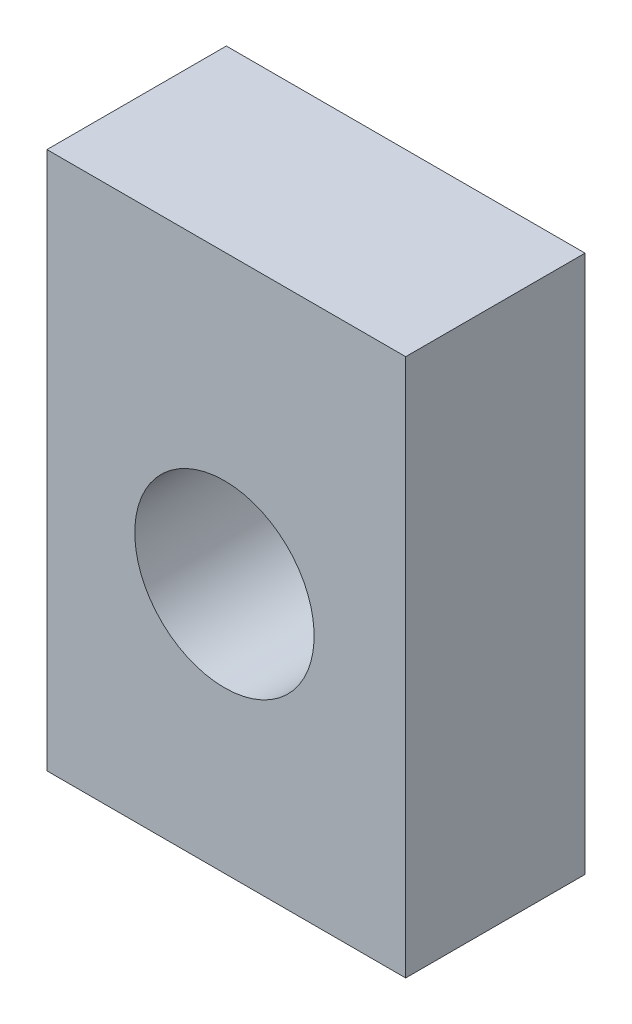
ISO-10303-21;
HEADER;
FILE_DESCRIPTION(('STEP AP214'),'2;1');
FILE_NAME('part.step','',(''),(''),'','','');
FILE_SCHEMA(('AUTOMOTIVE_DESIGN { 1 0 10303 214 1 1 1 1 }'));
ENDSEC;
DATA;
#1=APPLICATION_CONTEXT('core data for automotive mechanical design processes');
#2=APPLICATION_PROTOCOL_DEFINITION('international standard','automotive_design',2000,#1);
#3=PRODUCT_CONTEXT('',#1,'mechanical');
#4=PRODUCT('Part','Part','',(#3));
#5=PRODUCT_RELATED_PRODUCT_CATEGORY('part','',(#4));
#6=PRODUCT_DEFINITION_FORMATION('','',#4);
#7=PRODUCT_DEFINITION_CONTEXT('part definition',#1,'design');
#8=PRODUCT_DEFINITION('design','',#6,#7);
#9=PRODUCT_DEFINITION_SHAPE('','',#8);
#10=(LENGTH_UNIT() NAMED_UNIT(*) SI_UNIT(.MILLI.,.METRE.));
#11=(NAMED_UNIT(*) PLANE_ANGLE_UNIT() SI_UNIT($,.RADIAN.));
#12=(NAMED_UNIT(*) SI_UNIT($,.STERADIAN.) SOLID_ANGLE_UNIT());
#13=UNCERTAINTY_MEASURE_WITH_UNIT(LENGTH_MEASURE(1.E-05),#10,'distance_accuracy_value','');
#14=(GEOMETRIC_REPRESENTATION_CONTEXT(3) GLOBAL_UNCERTAINTY_ASSIGNED_CONTEXT((#13)) GLOBAL_UNIT_ASSIGNED_CONTEXT((#10,
#11,#12)) REPRESENTATION_CONTEXT('',''));
#15=CARTESIAN_POINT('',(0.,0.,0.));
#16=DIRECTION('',(0.,0.,1.));
#17=DIRECTION('',(1.,0.,0.));
#18=AXIS2_PLACEMENT_3D('',#15,#16,#17);
#19=CARTESIAN_POINT('',(12.7,9.525,-3.175));
#20=DIRECTION('',(0.,0.,1.));
#21=DIRECTION('',(0.,-1.,0.));
#22=AXIS2_PLACEMENT_3D('',#19,#20,#21);
#23=PLANE('',#22);
#24=CARTESIAN_POINT('',(6.28405567622139,-0.659443237786025,-3.175));
#25=DIRECTION('',(0.,0.,-1.));
#26=DIRECTION('',(0.,1.,0.));
#27=AXIS2_PLACEMENT_3D('',#24,#25,#26);
#28=CIRCLE('',#27,3.175);
#29=CARTESIAN_POINT('',(6.28405567622139,2.51555676221398,-3.175));
#30=VERTEX_POINT('',#29);
#31=EDGE_CURVE('E134',#30,#30,#28,.T.);
#32=ORIENTED_EDGE('',*,*,#31,.F.);
#33=EDGE_LOOP('',(#32));
#34=FACE_BOUND('',#33,.T.);
#35=DIRECTION('',(0.,1.,0.));
#36=VECTOR('',#35,1.);
#37=CARTESIAN_POINT('',(0.,9.525,-3.175));
#38=LINE('',#37,#36);
#39=CARTESIAN_POINT('',(0.,-9.525,-3.175));
#40=VERTEX_POINT('',#39);
#41=CARTESIAN_POINT('',(0.,9.525,-3.175));
#42=VERTEX_POINT('',#41);
#43=EDGE_CURVE('E113',#40,#42,#38,.T.);
#44=ORIENTED_EDGE('',*,*,#43,.T.);
#45=DIRECTION('',(-1.,0.,0.));
#46=VECTOR('',#45,1.);
#47=CARTESIAN_POINT('',(12.7,9.525,-3.175));
#48=LINE('',#47,#46);
#49=CARTESIAN_POINT('',(12.7,9.525,-3.175));
#50=VERTEX_POINT('',#49);
#51=EDGE_CURVE('E11',#50,#42,#48,.T.);
#52=ORIENTED_EDGE('',*,*,#51,.F.);
#53=DIRECTION('',(0.,1.,0.));
#54=VECTOR('',#53,1.);
#55=CARTESIAN_POINT('',(12.7,9.525,-3.175));
#56=LINE('',#55,#54);
#57=CARTESIAN_POINT('',(12.7,-9.525,-3.175));
#58=VERTEX_POINT('',#57);
#59=EDGE_CURVE('E97',#58,#50,#56,.T.);
#60=ORIENTED_EDGE('',*,*,#59,.F.);
#61=DIRECTION('',(-1.,0.,0.));
#62=VECTOR('',#61,1.);
#63=CARTESIAN_POINT('',(12.7,-9.525,-3.175));
#64=LINE('',#63,#62);
#65=EDGE_CURVE('E112',#58,#40,#64,.T.);
#66=ORIENTED_EDGE('',*,*,#65,.T.);
#67=EDGE_LOOP('',(#44,#52,#60,#66));
#68=FACE_BOUND('',#67,.T.);
#69=ADVANCED_FACE('F44',(#34,#68),#23,.F.);
#70=CARTESIAN_POINT('',(12.7,9.525,3.175));
#71=DIRECTION('',(0.,-1.,0.));
#72=DIRECTION('',(0.,0.,-1.));
#73=AXIS2_PLACEMENT_3D('',#70,#71,#72);
#74=PLANE('',#73);
#75=DIRECTION('',(0.,0.,1.));
#76=VECTOR('',#75,1.);
#77=CARTESIAN_POINT('',(0.,9.525,3.175));
#78=LINE('',#77,#76);
#79=CARTESIAN_POINT('',(0.,9.525,3.175));
#80=VERTEX_POINT('',#79);
#81=EDGE_CURVE('E104',#42,#80,#78,.T.);
#82=ORIENTED_EDGE('',*,*,#81,.T.);
#83=DIRECTION('',(-1.,0.,0.));
#84=VECTOR('',#83,1.);
#85=CARTESIAN_POINT('',(12.7,9.525,3.175));
#86=LINE('',#85,#84);
#87=CARTESIAN_POINT('',(12.7,9.525,3.175));
#88=VERTEX_POINT('',#87);
#89=EDGE_CURVE('E54',#88,#80,#86,.T.);
#90=ORIENTED_EDGE('',*,*,#89,.F.);
#91=DIRECTION('',(0.,0.,1.));
#92=VECTOR('',#91,1.);
#93=CARTESIAN_POINT('',(12.7,9.525,3.175));
#94=LINE('',#93,#92);
#95=EDGE_CURVE('E93',#50,#88,#94,.T.);
#96=ORIENTED_EDGE('',*,*,#95,.F.);
#97=ORIENTED_EDGE('',*,*,#51,.T.);
#98=EDGE_LOOP('',(#82,#90,#96,#97));
#99=FACE_BOUND('',#98,.T.);
#100=ADVANCED_FACE('F105',(#99),#74,.F.);
#101=CARTESIAN_POINT('',(12.7,9.525,3.175));
#102=DIRECTION('',(0.,0.,-1.));
#103=DIRECTION('',(0.,1.,0.));
#104=AXIS2_PLACEMENT_3D('',#101,#102,#103);
#105=PLANE('',#104);
#106=CARTESIAN_POINT('',(6.28405567622139,-0.659443237786025,3.175));
#107=DIRECTION('',(0.,0.,-1.));
#108=DIRECTION('',(0.,1.,0.));
#109=AXIS2_PLACEMENT_3D('',#106,#107,#108);
#110=CIRCLE('',#109,3.175);
#111=CARTESIAN_POINT('',(6.28405567622139,2.51555676221397,3.175));
#112=VERTEX_POINT('',#111);
#113=EDGE_CURVE('E48',#112,#112,#110,.T.);
#114=ORIENTED_EDGE('',*,*,#113,.T.);
#115=EDGE_LOOP('',(#114));
#116=FACE_BOUND('',#115,.T.);
#117=DIRECTION('',(0.,-1.,0.));
#118=VECTOR('',#117,1.);
#119=CARTESIAN_POINT('',(0.,9.525,3.175));
#120=LINE('',#119,#118);
#121=CARTESIAN_POINT('',(0.,-9.525,3.175));
#122=VERTEX_POINT('',#121);
#123=EDGE_CURVE('E79',#80,#122,#120,.T.);
#124=ORIENTED_EDGE('',*,*,#123,.T.);
#125=DIRECTION('',(-1.,0.,0.));
#126=VECTOR('',#125,1.);
#127=CARTESIAN_POINT('',(12.7,-9.525,3.175));
#128=LINE('',#127,#126);
#129=CARTESIAN_POINT('',(12.7,-9.525,3.175));
#130=VERTEX_POINT('',#129);
#131=EDGE_CURVE('E103',#130,#122,#128,.T.);
#132=ORIENTED_EDGE('',*,*,#131,.F.);
#133=DIRECTION('',(0.,-1.,0.));
#134=VECTOR('',#133,1.);
#135=CARTESIAN_POINT('',(12.7,9.525,3.175));
#136=LINE('',#135,#134);
#137=EDGE_CURVE('E96',#88,#130,#136,.T.);
#138=ORIENTED_EDGE('',*,*,#137,.F.);
#139=ORIENTED_EDGE('',*,*,#89,.T.);
#140=EDGE_LOOP('',(#124,#132,#138,#139));
#141=FACE_BOUND('',#140,.T.);
#142=ADVANCED_FACE('F110',(#116,#141),#105,.F.);
#143=CARTESIAN_POINT('',(12.7,-9.525,3.175));
#144=DIRECTION('',(0.,1.,0.));
#145=DIRECTION('',(0.,0.,1.));
#146=AXIS2_PLACEMENT_3D('',#143,#144,#145);
#147=PLANE('',#146);
#148=DIRECTION('',(0.,0.,-1.));
#149=VECTOR('',#148,1.);
#150=CARTESIAN_POINT('',(0.,-9.525,3.175));
#151=LINE('',#150,#149);
#152=EDGE_CURVE('E86',#122,#40,#151,.T.);
#153=ORIENTED_EDGE('',*,*,#152,.T.);
#154=ORIENTED_EDGE('',*,*,#65,.F.);
#155=DIRECTION('',(0.,0.,-1.));
#156=VECTOR('',#155,1.);
#157=CARTESIAN_POINT('',(12.7,-9.525,3.175));
#158=LINE('',#157,#156);
#159=EDGE_CURVE('E61',#130,#58,#158,.T.);
#160=ORIENTED_EDGE('',*,*,#159,.F.);
#161=ORIENTED_EDGE('',*,*,#131,.T.);
#162=EDGE_LOOP('',(#153,#154,#160,#161));
#163=FACE_BOUND('',#162,.T.);
#164=ADVANCED_FACE('F126',(#163),#147,.F.);
#165=CARTESIAN_POINT('',(12.7,0.,0.));
#166=DIRECTION('',(1.,0.,0.));
#167=DIRECTION('',(0.,0.,-1.));
#168=AXIS2_PLACEMENT_3D('',#165,#166,#167);
#169=PLANE('',#168);
#170=ORIENTED_EDGE('',*,*,#59,.T.);
#171=ORIENTED_EDGE('',*,*,#95,.T.);
#172=ORIENTED_EDGE('',*,*,#137,.T.);
#173=ORIENTED_EDGE('',*,*,#159,.T.);
#174=EDGE_LOOP('',(#170,#171,#172,#173));
#175=FACE_BOUND('',#174,.T.);
#176=ADVANCED_FACE('F92',(#175),#169,.T.);
#177=CARTESIAN_POINT('',(0.,0.,0.));
#178=DIRECTION('',(1.,0.,0.));
#179=DIRECTION('',(0.,0.,-1.));
#180=AXIS2_PLACEMENT_3D('',#177,#178,#179);
#181=PLANE('',#180);
#182=ORIENTED_EDGE('',*,*,#43,.F.);
#183=ORIENTED_EDGE('',*,*,#152,.F.);
#184=ORIENTED_EDGE('',*,*,#123,.F.);
#185=ORIENTED_EDGE('',*,*,#81,.F.);
#186=EDGE_LOOP('',(#182,#183,#184,#185));
#187=FACE_BOUND('',#186,.T.);
#188=ADVANCED_FACE('F131',(#187),#181,.F.);
#189=CARTESIAN_POINT('',(6.28405567622139,-0.659443237786026,9.525));
#190=DIRECTION('',(0.,0.,-1.));
#191=DIRECTION('',(0.,1.,0.));
#192=AXIS2_PLACEMENT_3D('',#189,#190,#191);
#193=CYLINDRICAL_SURFACE('',#192,3.175);
#194=ORIENTED_EDGE('',*,*,#31,.T.);
#195=EDGE_LOOP('',(#194));
#196=FACE_BOUND('',#195,.T.);
#197=ORIENTED_EDGE('',*,*,#113,.F.);
#198=EDGE_LOOP('',(#197));
#199=FACE_BOUND('',#198,.T.);
#200=ADVANCED_FACE('F144',(#196,#199),#193,.F.);
#201=CLOSED_SHELL('',(#69,#100,#142,#164,#176,#188,#200));
#202=MANIFOLD_SOLID_BREP('B2',#201);
#203=ADVANCED_BREP_SHAPE_REPRESENTATION('',(#18,#202),#14);
#204=SHAPE_DEFINITION_REPRESENTATION(#9,#203);
ENDSEC;
END-ISO-10303-21;
